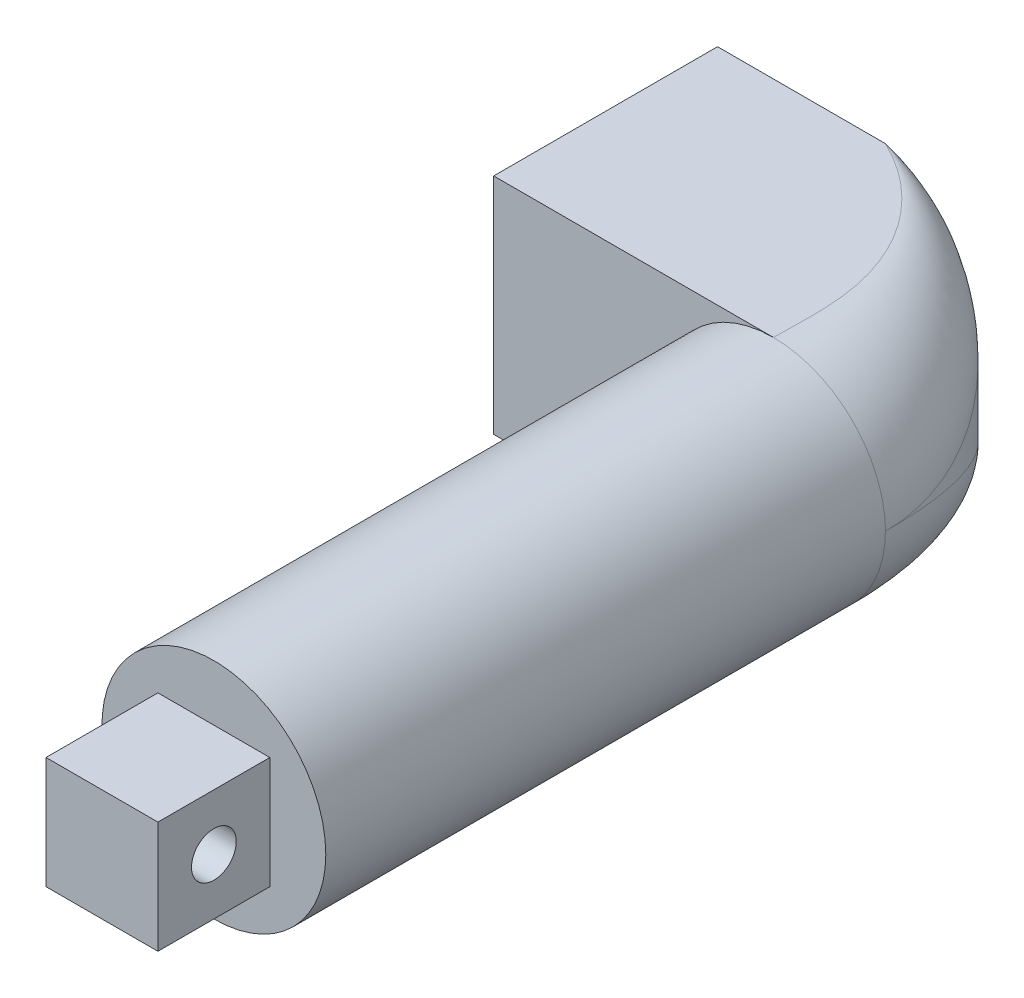
ISO-10303-21;
HEADER;
FILE_DESCRIPTION(('STEP AP214'),'2;1');
FILE_NAME('part.step','',(''),(''),'','','');
FILE_SCHEMA(('AUTOMOTIVE_DESIGN { 1 0 10303 214 1 1 1 1 }'));
ENDSEC;
DATA;
#1=APPLICATION_CONTEXT('core data for automotive mechanical design processes');
#2=APPLICATION_PROTOCOL_DEFINITION('international standard','automotive_design',2000,#1);
#3=PRODUCT_CONTEXT('',#1,'mechanical');
#4=PRODUCT('Part','Part','',(#3));
#5=PRODUCT_RELATED_PRODUCT_CATEGORY('part','',(#4));
#6=PRODUCT_DEFINITION_FORMATION('','',#4);
#7=PRODUCT_DEFINITION_CONTEXT('part definition',#1,'design');
#8=PRODUCT_DEFINITION('design','',#6,#7);
#9=PRODUCT_DEFINITION_SHAPE('','',#8);
#10=(LENGTH_UNIT() NAMED_UNIT(*) SI_UNIT(.MILLI.,.METRE.));
#11=(NAMED_UNIT(*) PLANE_ANGLE_UNIT() SI_UNIT($,.RADIAN.));
#12=(NAMED_UNIT(*) SI_UNIT($,.STERADIAN.) SOLID_ANGLE_UNIT());
#13=UNCERTAINTY_MEASURE_WITH_UNIT(LENGTH_MEASURE(1.E-05),#10,'distance_accuracy_value','');
#14=(GEOMETRIC_REPRESENTATION_CONTEXT(3) GLOBAL_UNCERTAINTY_ASSIGNED_CONTEXT((#13)) GLOBAL_UNIT_ASSIGNED_CONTEXT((#10,
#11,#12)) REPRESENTATION_CONTEXT('',''));
#15=CARTESIAN_POINT('',(0.,0.,0.));
#16=DIRECTION('',(0.,0.,1.));
#17=DIRECTION('',(1.,0.,0.));
#18=AXIS2_PLACEMENT_3D('',#15,#16,#17);
#19=CARTESIAN_POINT('',(15.,10.,10.));
#20=DIRECTION('',(0.,0.,-1.));
#21=DIRECTION('',(0.,1.,0.));
#22=AXIS2_PLACEMENT_3D('',#19,#20,#21);
#23=PLANE('',#22);
#24=CARTESIAN_POINT('',(24.9999999998989,0.,10.));
#25=DIRECTION('',(0.,0.,1.));
#26=DIRECTION('',(1.,0.,0.));
#27=AXIS2_PLACEMENT_3D('',#24,#25,#26);
#28=CIRCLE('',#27,10.0000000000875);
#29=CARTESIAN_POINT('',(24.9999790836981,10.0000000000656,10.));
#30=VERTEX_POINT('',#29);
#31=CARTESIAN_POINT('',(24.9999581674982,-10.,10.));
#32=VERTEX_POINT('',#31);
#33=EDGE_CURVE('E178',#30,#32,#28,.T.);
#34=ORIENTED_EDGE('',*,*,#33,.F.);
#35=DIRECTION('',(-1.,0.,0.));
#36=VECTOR('',#35,1.);
#37=CARTESIAN_POINT('',(15.,10.,10.));
#38=LINE('',#37,#36);
#39=CARTESIAN_POINT('',(0.,10.,10.));
#40=VERTEX_POINT('',#39);
#41=EDGE_CURVE('E239',#30,#40,#38,.T.);
#42=ORIENTED_EDGE('',*,*,#41,.T.);
#43=DIRECTION('',(0.,-1.,0.));
#44=VECTOR('',#43,1.);
#45=CARTESIAN_POINT('',(0.,10.,10.));
#46=LINE('',#45,#44);
#47=CARTESIAN_POINT('',(0.,-10.,10.));
#48=VERTEX_POINT('',#47);
#49=EDGE_CURVE('E230',#40,#48,#46,.T.);
#50=ORIENTED_EDGE('',*,*,#49,.T.);
#51=DIRECTION('',(-1.,0.,0.));
#52=VECTOR('',#51,1.);
#53=CARTESIAN_POINT('',(15.,-10.,10.));
#54=LINE('',#53,#52);
#55=EDGE_CURVE('E243',#32,#48,#54,.T.);
#56=ORIENTED_EDGE('',*,*,#55,.F.);
#57=EDGE_LOOP('',(#34,#42,#50,#56));
#58=FACE_BOUND('',#57,.T.);
#59=ADVANCED_FACE('F60',(#58),#23,.F.);
#60=CARTESIAN_POINT('',(15.,10.,10.));
#61=DIRECTION('',(0.,1.,0.));
#62=DIRECTION('',(0.,0.,1.));
#63=AXIS2_PLACEMENT_3D('',#60,#61,#62);
#64=PLANE('',#63);
#65=ORIENTED_EDGE('',*,*,#41,.F.);
#66=CARTESIAN_POINT('',(15.,10.,-10.));
#67=CARTESIAN_POINT('',(16.3749565177607,10.,-9.34350661944907));
#68=CARTESIAN_POINT('',(17.6118423525231,10.,-8.54557504270294));
#69=CARTESIAN_POINT('',(19.7751261513135,10.,-6.77535147640757));
#70=CARTESIAN_POINT('',(20.7011105689891,10.,-5.80380554577966));
#71=CARTESIAN_POINT('',(22.245432705062,10.,-3.7944516522111));
#72=CARTESIAN_POINT('',(22.8640307960509,10.,-2.75707721959613));
#73=CARTESIAN_POINT('',(23.8334490261289,10.,-0.7060221302084));
#74=CARTESIAN_POINT('',(24.1846624136271,10.,0.307343636058342));
#75=CARTESIAN_POINT('',(24.6852460589201,10.,2.24949239345835));
#76=CARTESIAN_POINT('',(24.8350972373865,10.,3.17811678628757));
#77=CARTESIAN_POINT('',(25.0116559788094,10.,4.92619712744708));
#78=CARTESIAN_POINT('',(25.038877066825,10.,5.74567292863553));
#79=CARTESIAN_POINT('',(25.0465000202597,10.,7.28932539063425));
#80=CARTESIAN_POINT('',(25.0273880128815,10.,8.01370464154866));
#81=CARTESIAN_POINT('',(25.0076434270292,10.,9.06553895436903));
#82=CARTESIAN_POINT('',(25.0023651337421,10.,9.41061528399421));
#83=CARTESIAN_POINT('',(24.9997626215836,10.,9.92643982329481));
#84=CARTESIAN_POINT('',(25.0009936060926,10.,10.0982045841938));
#85=CARTESIAN_POINT('',(24.9917178831913,10.,10.4416910596605));
#86=CARTESIAN_POINT('',(24.9826530695479,10.,10.6133147199374));
#87=CARTESIAN_POINT('',(24.9691733373313,10.,10.7845909572785));
#88=(BOUNDED_CURVE() B_SPLINE_CURVE(3,(#66,#67,#68,#69,#70,#71,#72,#73,#74,#75,#76,#77,#78,#79,
#80,#81,#82,#83,#84,#85,#86,#87),.UNSPECIFIED.,.F.,.F.) B_SPLINE_CURVE_WITH_KNOTS((4,2,2,2,2,2,
2,2,2,2,4),(0.,0.20616701789183,0.41233403578366,0.61850105367549,0.824668071567321,
1.03083508945915,1.23700210735098,1.44316912524281,1.54625263418873,1.59779438866168,
1.64933614313464),
.UNSPECIFIED.) CURVE() GEOMETRIC_REPRESENTATION_ITEM() RATIONAL_B_SPLINE_CURVE((1.,1.,1.,1.,1.,
1.,1.,1.,1.,1.,1.,1.,1.,1.,1.,1.,1.,1.,1.,1.,1.,1.)) REPRESENTATION_ITEM(''));
#89=CARTESIAN_POINT('',(15.,10.,-10.));
#90=VERTEX_POINT('',#89);
#91=EDGE_CURVE('E12',#30,#90,#88,.F.);
#92=ORIENTED_EDGE('',*,*,#91,.T.);
#93=DIRECTION('',(-1.,0.,0.));
#94=VECTOR('',#93,1.);
#95=CARTESIAN_POINT('',(15.,10.,-10.));
#96=LINE('',#95,#94);
#97=CARTESIAN_POINT('',(0.,10.,-10.));
#98=VERTEX_POINT('',#97);
#99=EDGE_CURVE('E257',#90,#98,#96,.T.);
#100=ORIENTED_EDGE('',*,*,#99,.T.);
#101=DIRECTION('',(0.,0.,-1.));
#102=VECTOR('',#101,1.);
#103=CARTESIAN_POINT('',(0.,10.,10.));
#104=LINE('',#103,#102);
#105=EDGE_CURVE('E221',#40,#98,#104,.T.);
#106=ORIENTED_EDGE('',*,*,#105,.F.);
#107=EDGE_LOOP('',(#65,#92,#100,#106));
#108=FACE_BOUND('',#107,.T.);
#109=ADVANCED_FACE('F293',(#108),#64,.T.);
#110=CARTESIAN_POINT('',(15.,-10.,10.));
#111=DIRECTION('',(0.,1.,0.));
#112=DIRECTION('',(0.,0.,1.));
#113=AXIS2_PLACEMENT_3D('',#110,#111,#112);
#114=PLANE('',#113);
#115=DIRECTION('',(-1.,0.,0.));
#116=VECTOR('',#115,1.);
#117=CARTESIAN_POINT('',(15.,-10.,-10.));
#118=LINE('',#117,#116);
#119=CARTESIAN_POINT('',(15.,-10.,-10.));
#120=VERTEX_POINT('',#119);
#121=CARTESIAN_POINT('',(0.,-10.,-10.));
#122=VERTEX_POINT('',#121);
#123=EDGE_CURVE('E388',#120,#122,#118,.T.);
#124=ORIENTED_EDGE('',*,*,#123,.F.);
#125=CARTESIAN_POINT('',(24.9691733373313,-10.,10.7845909572785));
#126=CARTESIAN_POINT('',(24.9826530695479,-10.,10.6133147199374));
#127=CARTESIAN_POINT('',(24.9917178831913,-10.,10.4416910596605));
#128=CARTESIAN_POINT('',(25.0009936060926,-10.,10.0982045841938));
#129=CARTESIAN_POINT('',(24.9997626215836,-10.,9.92643982329481));
#130=CARTESIAN_POINT('',(25.0023651337421,-10.,9.41061528399421));
#131=CARTESIAN_POINT('',(25.0076434270292,-10.,9.06553895436903));
#132=CARTESIAN_POINT('',(25.0273880128815,-10.,8.01370464154866));
#133=CARTESIAN_POINT('',(25.0465000202597,-10.,7.28932539063246));
#134=CARTESIAN_POINT('',(25.038877066825,-10.,5.74567292863732));
#135=CARTESIAN_POINT('',(25.0116559788118,-10.,4.92619712744649));
#136=CARTESIAN_POINT('',(24.8350972373841,-10.,3.17811678628817));
#137=CARTESIAN_POINT('',(24.6852460589201,-10.,2.24949239345835));
#138=CARTESIAN_POINT('',(24.1846624136271,-10.,0.307343636058344));
#139=CARTESIAN_POINT('',(23.8334490261313,-10.,-0.706022130210786));
#140=CARTESIAN_POINT('',(22.8640307960486,-10.,-2.75707721959375));
#141=CARTESIAN_POINT('',(22.2454327050596,-10.,-3.7944516522123));
#142=CARTESIAN_POINT('',(20.7011105689915,-10.,-5.80380554577847));
#143=CARTESIAN_POINT('',(19.7751261513135,-10.,-6.77535147640757));
#144=CARTESIAN_POINT('',(17.6118423525231,-10.,-8.54557504270294));
#145=CARTESIAN_POINT('',(16.374956517763,-10.,-9.34350661945392));
#146=CARTESIAN_POINT('',(15.,-10.,-10.));
#147=(BOUNDED_CURVE() B_SPLINE_CURVE(3,(#125,#126,#127,#128,#129,#130,#131,#132,#133,#134,#135,
#136,#137,#138,#139,#140,#141,#142,#143,#144,#145,#146),.UNSPECIFIED.,.F.,
.F.) B_SPLINE_CURVE_WITH_KNOTS((4,2,2,2,2,2,2,2,2,2,4),(0.,0.0515417544729575,0.103083508945915,
0.20616701789183,0.41233403578366,0.61850105367549,0.824668071567321,1.03083508945915,
1.23700210735098,1.44316912524281,1.64933614313464),
.UNSPECIFIED.) CURVE() GEOMETRIC_REPRESENTATION_ITEM() RATIONAL_B_SPLINE_CURVE((1.,1.,1.,1.,1.,
1.,1.,1.,1.,1.,1.,1.,1.,1.,1.,1.,1.,1.,1.,1.,1.,1.)) REPRESENTATION_ITEM(''));
#148=EDGE_CURVE('E242',#120,#32,#147,.F.);
#149=ORIENTED_EDGE('',*,*,#148,.T.);
#150=ORIENTED_EDGE('',*,*,#55,.T.);
#151=DIRECTION('',(0.,0.,-1.));
#152=VECTOR('',#151,1.);
#153=CARTESIAN_POINT('',(0.,-10.,10.));
#154=LINE('',#153,#152);
#155=EDGE_CURVE('E227',#48,#122,#154,.T.);
#156=ORIENTED_EDGE('',*,*,#155,.T.);
#157=EDGE_LOOP('',(#124,#149,#150,#156));
#158=FACE_BOUND('',#157,.T.);
#159=ADVANCED_FACE('F302',(#158),#114,.F.);
#160=CARTESIAN_POINT('',(15.,10.,-10.));
#161=DIRECTION('',(0.,0.,-1.));
#162=DIRECTION('',(0.,1.,0.));
#163=AXIS2_PLACEMENT_3D('',#160,#161,#162);
#164=PLANE('',#163);
#165=DIRECTION('',(0.,-1.,0.));
#166=VECTOR('',#165,1.);
#167=CARTESIAN_POINT('',(0.,10.,-10.));
#168=LINE('',#167,#166);
#169=EDGE_CURVE('E224',#98,#122,#168,.T.);
#170=ORIENTED_EDGE('',*,*,#169,.F.);
#171=ORIENTED_EDGE('',*,*,#99,.F.);
#172=DIRECTION('',(0.,-1.,0.));
#173=VECTOR('',#172,1.);
#174=CARTESIAN_POINT('',(15.,10.,-10.));
#175=LINE('',#174,#173);
#176=EDGE_CURVE('E233',#90,#120,#175,.T.);
#177=ORIENTED_EDGE('',*,*,#176,.T.);
#178=ORIENTED_EDGE('',*,*,#123,.T.);
#179=EDGE_LOOP('',(#170,#171,#177,#178));
#180=FACE_BOUND('',#179,.T.);
#181=ADVANCED_FACE('F303',(#180),#164,.T.);
#182=CARTESIAN_POINT('',(0.,0.,0.));
#183=DIRECTION('',(-1.,0.,0.));
#184=DIRECTION('',(0.,0.,1.));
#185=AXIS2_PLACEMENT_3D('',#182,#183,#184);
#186=PLANE('',#185);
#187=DIRECTION('',(0.,-1.,0.));
#188=VECTOR('',#187,1.);
#189=CARTESIAN_POINT('',(0.,0.,-7.75));
#190=LINE('',#189,#188);
#191=CARTESIAN_POINT('',(0.,7.75,-7.75));
#192=VERTEX_POINT('',#191);
#193=CARTESIAN_POINT('',(0.,-7.75,-7.75));
#194=VERTEX_POINT('',#193);
#195=EDGE_CURVE('E189',#192,#194,#190,.T.);
#196=ORIENTED_EDGE('',*,*,#195,.F.);
#197=DIRECTION('',(0.,0.,-1.));
#198=VECTOR('',#197,1.);
#199=CARTESIAN_POINT('',(0.,7.75,0.));
#200=LINE('',#199,#198);
#201=CARTESIAN_POINT('',(0.,7.75,7.75));
#202=VERTEX_POINT('',#201);
#203=EDGE_CURVE('E205',#202,#192,#200,.T.);
#204=ORIENTED_EDGE('',*,*,#203,.F.);
#205=DIRECTION('',(0.,-1.,0.));
#206=VECTOR('',#205,1.);
#207=CARTESIAN_POINT('',(0.,0.,7.75));
#208=LINE('',#207,#206);
#209=CARTESIAN_POINT('',(0.,-7.75,7.75));
#210=VERTEX_POINT('',#209);
#211=EDGE_CURVE('E208',#202,#210,#208,.T.);
#212=ORIENTED_EDGE('',*,*,#211,.T.);
#213=DIRECTION('',(0.,0.,-1.));
#214=VECTOR('',#213,1.);
#215=CARTESIAN_POINT('',(0.,-7.75,0.));
#216=LINE('',#215,#214);
#217=EDGE_CURVE('E195',#210,#194,#216,.T.);
#218=ORIENTED_EDGE('',*,*,#217,.T.);
#219=EDGE_LOOP('',(#196,#204,#212,#218));
#220=FACE_BOUND('',#219,.T.);
#221=ORIENTED_EDGE('',*,*,#105,.T.);
#222=ORIENTED_EDGE('',*,*,#169,.T.);
#223=ORIENTED_EDGE('',*,*,#155,.F.);
#224=ORIENTED_EDGE('',*,*,#49,.F.);
#225=EDGE_LOOP('',(#221,#222,#223,#224));
#226=FACE_BOUND('',#225,.T.);
#227=ADVANCED_FACE('F404',(#220,#226),#186,.T.);
#228=CARTESIAN_POINT('',(15.,0.,-7.75));
#229=DIRECTION('',(0.,0.,-1.));
#230=DIRECTION('',(0.,1.,0.));
#231=AXIS2_PLACEMENT_3D('',#228,#229,#230);
#232=PLANE('',#231);
#233=ORIENTED_EDGE('',*,*,#195,.T.);
#234=DIRECTION('',(-1.,0.,0.));
#235=VECTOR('',#234,1.);
#236=CARTESIAN_POINT('',(15.,-7.75,-7.75));
#237=LINE('',#236,#235);
#238=CARTESIAN_POINT('',(15.,-7.75,-7.75));
#239=VERTEX_POINT('',#238);
#240=EDGE_CURVE('E203',#239,#194,#237,.T.);
#241=ORIENTED_EDGE('',*,*,#240,.F.);
#242=DIRECTION('',(0.,-1.,0.));
#243=VECTOR('',#242,1.);
#244=CARTESIAN_POINT('',(15.,0.,-7.75));
#245=LINE('',#244,#243);
#246=CARTESIAN_POINT('',(15.,7.75,-7.75));
#247=VERTEX_POINT('',#246);
#248=EDGE_CURVE('E192',#247,#239,#245,.T.);
#249=ORIENTED_EDGE('',*,*,#248,.F.);
#250=DIRECTION('',(-1.,0.,0.));
#251=VECTOR('',#250,1.);
#252=CARTESIAN_POINT('',(15.,7.75,-7.75));
#253=LINE('',#252,#251);
#254=EDGE_CURVE('E219',#247,#192,#253,.T.);
#255=ORIENTED_EDGE('',*,*,#254,.T.);
#256=EDGE_LOOP('',(#233,#241,#249,#255));
#257=FACE_BOUND('',#256,.T.);
#258=ADVANCED_FACE('F406',(#257),#232,.F.);
#259=CARTESIAN_POINT('',(15.,7.75,0.));
#260=DIRECTION('',(0.,1.,0.));
#261=DIRECTION('',(0.,0.,1.));
#262=AXIS2_PLACEMENT_3D('',#259,#260,#261);
#263=PLANE('',#262);
#264=ORIENTED_EDGE('',*,*,#203,.T.);
#265=ORIENTED_EDGE('',*,*,#254,.F.);
#266=DIRECTION('',(0.,0.,-1.));
#267=VECTOR('',#266,1.);
#268=CARTESIAN_POINT('',(15.,7.75,0.));
#269=LINE('',#268,#267);
#270=CARTESIAN_POINT('',(15.,7.75,7.75));
#271=VERTEX_POINT('',#270);
#272=EDGE_CURVE('E194',#271,#247,#269,.T.);
#273=ORIENTED_EDGE('',*,*,#272,.F.);
#274=DIRECTION('',(-1.,0.,0.));
#275=VECTOR('',#274,1.);
#276=CARTESIAN_POINT('',(15.,7.75,7.75));
#277=LINE('',#276,#275);
#278=EDGE_CURVE('E217',#271,#202,#277,.T.);
#279=ORIENTED_EDGE('',*,*,#278,.T.);
#280=EDGE_LOOP('',(#264,#265,#273,#279));
#281=FACE_BOUND('',#280,.T.);
#282=ADVANCED_FACE('F413',(#281),#263,.F.);
#283=CARTESIAN_POINT('',(15.,0.,7.75));
#284=DIRECTION('',(0.,0.,-1.));
#285=DIRECTION('',(0.,1.,0.));
#286=AXIS2_PLACEMENT_3D('',#283,#284,#285);
#287=PLANE('',#286);
#288=ORIENTED_EDGE('',*,*,#211,.F.);
#289=ORIENTED_EDGE('',*,*,#278,.F.);
#290=DIRECTION('',(0.,-1.,0.));
#291=VECTOR('',#290,1.);
#292=CARTESIAN_POINT('',(15.,0.,7.75));
#293=LINE('',#292,#291);
#294=CARTESIAN_POINT('',(15.,-7.75,7.75));
#295=VERTEX_POINT('',#294);
#296=EDGE_CURVE('E197',#271,#295,#293,.T.);
#297=ORIENTED_EDGE('',*,*,#296,.T.);
#298=DIRECTION('',(-1.,0.,0.));
#299=VECTOR('',#298,1.);
#300=CARTESIAN_POINT('',(15.,-7.75,7.75));
#301=LINE('',#300,#299);
#302=EDGE_CURVE('E215',#295,#210,#301,.T.);
#303=ORIENTED_EDGE('',*,*,#302,.T.);
#304=EDGE_LOOP('',(#288,#289,#297,#303));
#305=FACE_BOUND('',#304,.T.);
#306=ADVANCED_FACE('F586',(#305),#287,.T.);
#307=CARTESIAN_POINT('',(15.,-7.75,0.));
#308=DIRECTION('',(0.,1.,0.));
#309=DIRECTION('',(0.,0.,1.));
#310=AXIS2_PLACEMENT_3D('',#307,#308,#309);
#311=PLANE('',#310);
#312=ORIENTED_EDGE('',*,*,#217,.F.);
#313=ORIENTED_EDGE('',*,*,#302,.F.);
#314=DIRECTION('',(0.,0.,-1.));
#315=VECTOR('',#314,1.);
#316=CARTESIAN_POINT('',(15.,-7.75,0.));
#317=LINE('',#316,#315);
#318=EDGE_CURVE('E200',#295,#239,#317,.T.);
#319=ORIENTED_EDGE('',*,*,#318,.T.);
#320=ORIENTED_EDGE('',*,*,#240,.T.);
#321=EDGE_LOOP('',(#312,#313,#319,#320));
#322=FACE_BOUND('',#321,.T.);
#323=ADVANCED_FACE('F457',(#322),#311,.T.);
#324=CARTESIAN_POINT('',(15.,0.,0.));
#325=DIRECTION('',(-1.,0.,0.));
#326=DIRECTION('',(0.,0.,1.));
#327=AXIS2_PLACEMENT_3D('',#324,#325,#326);
#328=PLANE('',#327);
#329=ORIENTED_EDGE('',*,*,#296,.F.);
#330=ORIENTED_EDGE('',*,*,#272,.T.);
#331=ORIENTED_EDGE('',*,*,#248,.T.);
#332=ORIENTED_EDGE('',*,*,#318,.F.);
#333=EDGE_LOOP('',(#329,#330,#331,#332));
#334=FACE_BOUND('',#333,.T.);
#335=ADVANCED_FACE('F269',(#334),#328,.T.);
#336=CARTESIAN_POINT('',(15.,0.,10.));
#337=DIRECTION('',(0.,-1.,0.));
#338=DIRECTION('',(0.,0.,-1.));
#339=AXIS2_PLACEMENT_3D('',#336,#337,#338);
#340=CYLINDRICAL_SURFACE('',#339,20.);
#341=CARTESIAN_POINT('',(34.9383466746626,0.,11.5691819145569));
#342=CARTESIAN_POINT('',(34.965306139097,0.,11.2266294398749));
#343=CARTESIAN_POINT('',(34.9834357663823,0.,10.883382119321));
#344=CARTESIAN_POINT('',(35.0019872121856,0.,10.1964091683877));
#345=CARTESIAN_POINT('',(35.0024090270872,-0.00144386285960368,9.8526836364662));
#346=CARTESIAN_POINT('',(34.9771110675979,0.0138168333852222,8.82215901569282));
#347=CARTESIAN_POINT('',(34.9248044387159,0.0451873780405984,8.13601392966993));
#348=CARTESIAN_POINT('',(34.6623929898257,0.198649902121924,6.09111193822538));
#349=CARTESIAN_POINT('',(34.3464311764276,0.380092773660664,4.74598204213419));
#350=CARTESIAN_POINT('',(33.4458106822476,0.878637695089336,2.14881077539806));
#351=CARTESIAN_POINT('',(32.8611790641125,1.19573974631466,0.896847446871601));
#352=CARTESIAN_POINT('',(31.4479653358984,1.9429931638416,-1.46095721460047));
#353=CARTESIAN_POINT('',(30.6194256913203,2.37314453147233,-2.56672769813793));
#354=CARTESIAN_POINT('',(28.7534746861072,3.32388671852766,-4.58530212317974));
#355=CARTESIAN_POINT('',(27.7161193952266,3.84447753928414,-5.49804540876557));
#356=CARTESIAN_POINT('',(25.4764625298339,4.95348876930961,-7.09189389233401));
#357=CARTESIAN_POINT('',(24.2742282545247,5.54190917990907,-7.77295119694005));
#358=CARTESIAN_POINT('',(21.755725069601,6.76396972634093,-8.87456708774539));
#359=CARTESIAN_POINT('',(20.4395318382309,7.39760986350338,-9.29509257160221));
#360=CARTESIAN_POINT('',(17.7488522701442,8.68749999977787,-9.85781748236069));
#361=CARTESIAN_POINT('',(16.3744622152341,9.34374263315969,-10.));
#362=CARTESIAN_POINT('',(15.,10.,-10.));
#363=(BOUNDED_CURVE() B_SPLINE_CURVE(3,(#341,#342,#343,#344,#345,#346,#347,#348,#349,#350,#351,
#352,#353,#354,#355,#356,#357,#358,#359,#360,#361,#362),.UNSPECIFIED.,.F.,
.F.) B_SPLINE_CURVE_WITH_KNOTS((4,2,2,2,2,2,2,2,2,2,4),(0.,0.0515417544729575,0.103083508945915,
0.20616701789183,0.41233403578366,0.61850105367549,0.824668071567321,1.03083508945915,
1.23700210735098,1.44316912524281,1.64933614313464),
.UNSPECIFIED.) CURVE() GEOMETRIC_REPRESENTATION_ITEM() RATIONAL_B_SPLINE_CURVE((1.,1.,1.,1.,1.,
1.,1.,1.,1.,1.,1.,1.,1.,1.,1.,1.,1.,1.,1.,1.,1.,1.)) REPRESENTATION_ITEM(''));
#364=CARTESIAN_POINT('',(34.9999999999639,2.11824543335629E-05,10.));
#365=VERTEX_POINT('',#364);
#366=EDGE_CURVE('E251',#90,#365,#363,.F.);
#367=ORIENTED_EDGE('',*,*,#366,.T.);
#368=CARTESIAN_POINT('',(15.,-10.,-10.));
#369=CARTESIAN_POINT('',(16.3744622152328,-9.34374263316029,-10.));
#370=CARTESIAN_POINT('',(17.7488522701463,-8.68749999977787,-9.85781748236026));
#371=CARTESIAN_POINT('',(20.4395318382289,-7.39760986350338,-9.29509257160264));
#372=CARTESIAN_POINT('',(21.7557250696083,-6.76396972634093,-8.87456708774219));
#373=CARTESIAN_POINT('',(24.2742282545174,-5.54190917990907,-7.77295119694325));
#374=CARTESIAN_POINT('',(25.4764625298345,-4.95348876930961,-7.09189389233361));
#375=CARTESIAN_POINT('',(27.7161193952261,-3.84447753928414,-5.49804540876598));
#376=CARTESIAN_POINT('',(28.7534746861072,-3.32388671852766,-4.58530212317974));
#377=CARTESIAN_POINT('',(30.6194256913203,-2.37314453147233,-2.56672769813793));
#378=CARTESIAN_POINT('',(31.4479653358979,-1.9429931638416,-1.46095721460125));
#379=CARTESIAN_POINT('',(32.861179064113,-1.19573974631466,0.896847446872393));
#380=CARTESIAN_POINT('',(33.4458106822478,-0.878637695089336,2.14881077539885));
#381=CARTESIAN_POINT('',(34.3464311764273,-0.380092773660664,4.74598204213339));
#382=CARTESIAN_POINT('',(34.6623929898257,-0.198649902121924,6.09111193822538));
#383=CARTESIAN_POINT('',(34.9248044387159,-0.0451873780405984,8.13601392966993));
#384=CARTESIAN_POINT('',(34.9771110675979,-0.0138168333852222,8.82215901569281));
#385=CARTESIAN_POINT('',(35.0024090270872,0.00144386285960368,9.8526836364662));
#386=CARTESIAN_POINT('',(35.0019872121856,0.,10.1964091683877));
#387=CARTESIAN_POINT('',(34.9834357663823,0.,10.883382119321));
#388=CARTESIAN_POINT('',(34.965306139097,0.,11.2266294398749));
#389=CARTESIAN_POINT('',(34.9383466746626,0.,11.5691819145569));
#390=(BOUNDED_CURVE() B_SPLINE_CURVE(3,(#368,#369,#370,#371,#372,#373,#374,#375,#376,#377,#378,
#379,#380,#381,#382,#383,#384,#385,#386,#387,#388,#389),.UNSPECIFIED.,.F.,
.F.) B_SPLINE_CURVE_WITH_KNOTS((4,2,2,2,2,2,2,2,2,2,4),(0.,0.20616701789183,0.41233403578366,
0.61850105367549,0.824668071567321,1.03083508945915,1.23700210735098,1.44316912524281,
1.54625263418873,1.59779438866168,1.64933614313464),
.UNSPECIFIED.) CURVE() GEOMETRIC_REPRESENTATION_ITEM() RATIONAL_B_SPLINE_CURVE((1.,1.,1.,1.,1.,
1.,1.,1.,1.,1.,1.,1.,1.,1.,1.,1.,1.,1.,1.,1.,1.,1.)) REPRESENTATION_ITEM(''));
#391=EDGE_CURVE('E75',#365,#120,#390,.F.);
#392=ORIENTED_EDGE('',*,*,#391,.T.);
#393=ORIENTED_EDGE('',*,*,#176,.F.);
#394=EDGE_LOOP('',(#367,#392,#393));
#395=FACE_BOUND('',#394,.T.);
#396=ADVANCED_FACE('F259',(#395),#340,.T.);
#397=CARTESIAN_POINT('',(15.,-10.,-10.));
#398=CARTESIAN_POINT('',(16.374956517763,-10.,-9.34350661945392));
#399=CARTESIAN_POINT('',(17.6118423525231,-10.,-8.54557504270294));
#400=CARTESIAN_POINT('',(19.7751261513135,-10.,-6.77535147640757));
#401=CARTESIAN_POINT('',(20.7011105689915,-10.,-5.80380554577847));
#402=CARTESIAN_POINT('',(22.2454327050596,-10.,-3.7944516522123));
#403=CARTESIAN_POINT('',(22.8640307960486,-10.,-2.75707721959375));
#404=CARTESIAN_POINT('',(23.8334490261313,-10.,-0.706022130210786));
#405=CARTESIAN_POINT('',(24.1846624136271,-10.,0.307343636058344));
#406=CARTESIAN_POINT('',(24.6852460589201,-10.,2.24949239345835));
#407=CARTESIAN_POINT('',(24.8350972373841,-10.,3.17811678628817));
#408=CARTESIAN_POINT('',(25.0116559788118,-10.,4.92619712744649));
#409=CARTESIAN_POINT('',(25.038877066825,-10.,5.74567292863732));
#410=CARTESIAN_POINT('',(25.0465000202597,-10.,7.28932539063246));
#411=CARTESIAN_POINT('',(25.0273880128815,-10.,8.01370464154866));
#412=CARTESIAN_POINT('',(25.0076434270292,-10.,9.06553895436903));
#413=CARTESIAN_POINT('',(25.0023651337421,-10.,9.41061528399421));
#414=CARTESIAN_POINT('',(24.9997626215836,-10.,9.92643982329481));
#415=CARTESIAN_POINT('',(25.0009936060926,-10.,10.0982045841938));
#416=CARTESIAN_POINT('',(24.9917178831913,-10.,10.4416910596605));
#417=CARTESIAN_POINT('',(24.9826530695479,-10.,10.6133147199374));
#418=CARTESIAN_POINT('',(24.9691733373313,-10.,10.7845909572785));
#419=CARTESIAN_POINT('',(15.,-10.,-10.));
#420=CARTESIAN_POINT('',(16.3744657327191,-9.99999999999523,-10.0000000000048));
#421=CARTESIAN_POINT('',(17.7488522701466,-10.,-9.85781748236174));
#422=CARTESIAN_POINT('',(20.4395318382286,-10.,-9.29509257160116));
#423=CARTESIAN_POINT('',(21.7557250696082,-9.99999999999881,-8.87456708774189));
#424=CARTESIAN_POINT('',(24.2742282545175,-10.0000000000012,-7.77295119694356));
#425=CARTESIAN_POINT('',(25.4764625298333,-10.0000000000012,-7.09189389233189));
#426=CARTESIAN_POINT('',(27.7161193952273,-9.99999999999881,-5.4980454087677));
#427=CARTESIAN_POINT('',(28.7534746861072,-10.0000000000012,-4.58530212318212));
#428=CARTESIAN_POINT('',(30.6194256913203,-9.99999999999881,-2.56672769813555));
#429=CARTESIAN_POINT('',(31.4479653358978,-9.99999999999762,-1.46095721460055));
#430=CARTESIAN_POINT('',(32.8611790641131,-10.0000000000024,0.896847446871693));
#431=CARTESIAN_POINT('',(33.4458106822506,-9.99999999999762,2.14881077539939));
#432=CARTESIAN_POINT('',(34.3464311764245,-10.0000000000024,4.74598204213285));
#433=CARTESIAN_POINT('',(34.6623929898225,-10.,6.09111193822579));
#434=CARTESIAN_POINT('',(34.9248044387175,-10.,8.13601392966973));
#435=CARTESIAN_POINT('',(34.977111067599,-10.0000000000012,8.82215901569278));
#436=CARTESIAN_POINT('',(35.0024090270867,-9.9999999999994,9.85268363646621));
#437=CARTESIAN_POINT('',(35.0019872121852,-10.,10.1964091683876));
#438=CARTESIAN_POINT('',(34.9834357663827,-10.,10.883382119321));
#439=CARTESIAN_POINT('',(34.9653061391007,-9.99999999999762,11.2266294398752));
#440=CARTESIAN_POINT('',(34.9383466746626,-10.,11.5691819145569));
#441=CARTESIAN_POINT('',(15.,-10.,-10.));
#442=CARTESIAN_POINT('',(16.3744622152328,-9.34374263316029,-10.));
#443=CARTESIAN_POINT('',(17.7488522701463,-8.68749999977787,-9.85781748236026));
#444=CARTESIAN_POINT('',(20.4395318382289,-7.39760986350338,-9.29509257160264));
#445=CARTESIAN_POINT('',(21.7557250696083,-6.76396972634093,-8.87456708774219));
#446=CARTESIAN_POINT('',(24.2742282545174,-5.54190917990907,-7.77295119694325));
#447=CARTESIAN_POINT('',(25.4764625298345,-4.95348876930961,-7.09189389233361));
#448=CARTESIAN_POINT('',(27.7161193952261,-3.84447753928414,-5.49804540876598));
#449=CARTESIAN_POINT('',(28.7534746861072,-3.32388671852766,-4.58530212317974));
#450=CARTESIAN_POINT('',(30.6194256913203,-2.37314453147233,-2.56672769813793));
#451=CARTESIAN_POINT('',(31.4479653358979,-1.9429931638416,-1.46095721460125));
#452=CARTESIAN_POINT('',(32.861179064113,-1.19573974631466,0.896847446872393));
#453=CARTESIAN_POINT('',(33.4458106822478,-0.878637695089336,2.14881077539885));
#454=CARTESIAN_POINT('',(34.3464311764273,-0.380092773660664,4.74598204213339));
#455=CARTESIAN_POINT('',(34.6623929898257,-0.198649902121924,6.09111193822538));
#456=CARTESIAN_POINT('',(34.9248044387159,-0.0451873780405984,8.13601392966993));
#457=CARTESIAN_POINT('',(34.9771110675979,-0.0138168333852222,8.82215901569281));
#458=CARTESIAN_POINT('',(35.0024090270872,0.00144386285960368,9.8526836364662));
#459=CARTESIAN_POINT('',(35.0019872121856,0.,10.1964091683877));
#460=CARTESIAN_POINT('',(34.9834357663823,0.,10.883382119321));
#461=CARTESIAN_POINT('',(34.965306139097,0.,11.2266294398749));
#462=CARTESIAN_POINT('',(34.9383466746626,0.,11.5691819145569));
#463=(BOUNDED_SURFACE() B_SPLINE_SURFACE(2,3,((#397,#398,#399,#400,#401,#402,#403,#404,#405,
#406,#407,#408,#409,#410,#411,#412,#413,#414,#415,#416,#417,#418),(#419,#420,#421,#422,#423,
#424,#425,#426,#427,#428,#429,#430,#431,#432,#433,#434,#435,#436,#437,#438,#439,#440),(#441,
#442,#443,#444,#445,#446,#447,#448,#449,#450,#451,#452,#453,#454,#455,#456,#457,#458,#459,#460,
#461,#462)),.UNSPECIFIED.,.F.,.F.,.F.) B_SPLINE_SURFACE_WITH_KNOTS((3,3),(4,2,2,2,2,2,2,2,2,2,
4),(0.,1.),(0.,0.20616701789183,0.41233403578366,0.61850105367549,0.824668071567321,
1.03083508945915,1.23700210735098,1.44316912524281,1.54625263418873,1.59779438866168,
1.64933614313464),.UNSPECIFIED.) GEOMETRIC_REPRESENTATION_ITEM() RATIONAL_B_SPLINE_SURFACE(((1.,
1.,1.,1.,1.,1.,1.,1.,1.,1.,1.,1.,1.,1.,1.,1.,1.,1.,1.,1.,1.,1.),(0.707106781186548,
0.707106781186548,0.707106781186548,0.707106781186548,0.707106781186548,0.707106781186548,
0.707106781186548,0.707106781186548,0.707106781186548,0.707106781186548,0.707106781186548,
0.707106781186548,0.707106781186548,0.707106781186548,0.707106781186548,0.707106781186548,
0.707106781186548,0.707106781186548,0.707106781186548,0.707106781186548,0.707106781186548,
0.707106781186548),(1.,1.,1.,1.,1.,1.,1.,1.,1.,1.,1.,1.,1.,1.,1.,1.,1.,1.,1.,1.,1.,1.))) REPRESENTATION_ITEM('') SURFACE());
#464=CARTESIAN_POINT('',(34.9999996340996,4.23146510295195E-05,9.99997443500805));
#465=CARTESIAN_POINT('',(34.9999996340993,-9.99999999999977,9.99997443500805));
#466=CARTESIAN_POINT('',(24.9999581172428,-10.,10.0000127826847));
#467=(BOUNDED_CURVE() B_SPLINE_CURVE(2,(#464,#465,#466),.UNSPECIFIED.,.F.,
.F.) B_SPLINE_CURVE_WITH_KNOTS((3,3),(0.,1.),
.UNSPECIFIED.) CURVE() GEOMETRIC_REPRESENTATION_ITEM() RATIONAL_B_SPLINE_CURVE((1.,
0.707106781186547,1.)) REPRESENTATION_ITEM(''));
#468=EDGE_CURVE('E381',#32,#365,#467,.F.);
#469=ORIENTED_EDGE('',*,*,#148,.F.);
#470=ORIENTED_EDGE('',*,*,#391,.F.);
#471=ORIENTED_EDGE('',*,*,#468,.F.);
#472=EDGE_LOOP('',(#469,#470,#471));
#473=FACE_BOUND('',#472,.T.);
#474=ADVANCED_FACE('F268',(#473),#463,.T.);
#475=CARTESIAN_POINT('',(15.,10.,-10.));
#476=CARTESIAN_POINT('',(16.3744622152341,9.34374263315969,-10.));
#477=CARTESIAN_POINT('',(17.7488522701442,8.68749999977787,-9.85781748236069));
#478=CARTESIAN_POINT('',(20.4395318382309,7.39760986350338,-9.29509257160221));
#479=CARTESIAN_POINT('',(21.755725069601,6.76396972634093,-8.87456708774539));
#480=CARTESIAN_POINT('',(24.2742282545247,5.54190917990907,-7.77295119694005));
#481=CARTESIAN_POINT('',(25.4764625298339,4.95348876930961,-7.09189389233401));
#482=CARTESIAN_POINT('',(27.7161193952266,3.84447753928414,-5.49804540876557));
#483=CARTESIAN_POINT('',(28.7534746861072,3.32388671852766,-4.58530212317974));
#484=CARTESIAN_POINT('',(30.6194256913203,2.37314453147233,-2.56672769813793));
#485=CARTESIAN_POINT('',(31.4479653358984,1.9429931638416,-1.46095721460047));
#486=CARTESIAN_POINT('',(32.8611790641125,1.19573974631466,0.896847446871601));
#487=CARTESIAN_POINT('',(33.4458106822476,0.878637695089336,2.14881077539806));
#488=CARTESIAN_POINT('',(34.3464311764276,0.380092773660664,4.74598204213419));
#489=CARTESIAN_POINT('',(34.6623929898257,0.198649902121924,6.09111193822538));
#490=CARTESIAN_POINT('',(34.9248044387159,0.0451873780405984,8.13601392966993));
#491=CARTESIAN_POINT('',(34.9771110675979,0.0138168333852222,8.82215901569282));
#492=CARTESIAN_POINT('',(35.0024090270872,-0.00144386285960368,9.8526836364662));
#493=CARTESIAN_POINT('',(35.0019872121856,0.,10.1964091683877));
#494=CARTESIAN_POINT('',(34.9834357663823,0.,10.883382119321));
#495=CARTESIAN_POINT('',(34.965306139097,0.,11.2266294398749));
#496=CARTESIAN_POINT('',(34.9383466746626,0.,11.5691819145569));
#497=CARTESIAN_POINT('',(15.,10.,-10.));
#498=CARTESIAN_POINT('',(16.3744657327209,9.99999999999881,-10.0000000000024));
#499=CARTESIAN_POINT('',(17.7488522701442,9.99999999999762,-9.85781748236055));
#500=CARTESIAN_POINT('',(20.439531838231,10.0000000000024,-9.29509257160236));
#501=CARTESIAN_POINT('',(21.755725069601,9.99999999999881,-8.87456708774546));
#502=CARTESIAN_POINT('',(24.2742282545246,10.0000000000012,-7.77295119693998));
#503=CARTESIAN_POINT('',(25.4764625298333,9.99999999999761,-7.09189389233367));
#504=CARTESIAN_POINT('',(27.7161193952273,10.0000000000024,-5.49804540876591));
#505=CARTESIAN_POINT('',(28.7534746861072,10.0000000000012,-4.58530212318212));
#506=CARTESIAN_POINT('',(30.6194256913203,9.99999999999881,-2.56672769813555));
#507=CARTESIAN_POINT('',(31.4479653359073,9.99999999999523,-1.46095721459996));
#508=CARTESIAN_POINT('',(32.8611790641036,10.0000000000048,0.896847446871092));
#509=CARTESIAN_POINT('',(33.4458106822506,9.99999999999762,2.14881077539791));
#510=CARTESIAN_POINT('',(34.3464311764245,10.0000000000024,4.74598204213435));
#511=CARTESIAN_POINT('',(34.6623929898225,10.,6.09111193822579));
#512=CARTESIAN_POINT('',(34.9248044387175,10.,8.13601392966973));
#513=CARTESIAN_POINT('',(34.977111067599,10.0000000000012,8.82215901569279));
#514=CARTESIAN_POINT('',(35.0024090270866,9.99999999999941,9.85268363646622));
#515=CARTESIAN_POINT('',(35.0019872121852,10.,10.1964091683876));
#516=CARTESIAN_POINT('',(34.9834357663827,10.,10.883382119321));
#517=CARTESIAN_POINT('',(34.9653061391007,9.99999999999762,11.2266294398752));
#518=CARTESIAN_POINT('',(34.9383466746626,10.,11.5691819145569));
#519=CARTESIAN_POINT('',(15.,10.,-10.));
#520=CARTESIAN_POINT('',(16.3749565177607,10.,-9.34350661944907));
#521=CARTESIAN_POINT('',(17.6118423525231,10.,-8.54557504270294));
#522=CARTESIAN_POINT('',(19.7751261513135,10.,-6.77535147640757));
#523=CARTESIAN_POINT('',(20.7011105689891,10.,-5.80380554577966));
#524=CARTESIAN_POINT('',(22.245432705062,10.,-3.7944516522111));
#525=CARTESIAN_POINT('',(22.8640307960509,10.,-2.75707721959613));
#526=CARTESIAN_POINT('',(23.8334490261289,10.,-0.7060221302084));
#527=CARTESIAN_POINT('',(24.1846624136271,10.,0.307343636058342));
#528=CARTESIAN_POINT('',(24.6852460589201,10.,2.24949239345835));
#529=CARTESIAN_POINT('',(24.8350972373865,10.,3.17811678628757));
#530=CARTESIAN_POINT('',(25.0116559788094,10.,4.92619712744708));
#531=CARTESIAN_POINT('',(25.038877066825,10.,5.74567292863553));
#532=CARTESIAN_POINT('',(25.0465000202597,10.,7.28932539063425));
#533=CARTESIAN_POINT('',(25.0273880128815,10.,8.01370464154866));
#534=CARTESIAN_POINT('',(25.0076434270292,10.,9.06553895436903));
#535=CARTESIAN_POINT('',(25.0023651337421,10.,9.41061528399421));
#536=CARTESIAN_POINT('',(24.9997626215836,10.,9.92643982329481));
#537=CARTESIAN_POINT('',(25.0009936060926,10.,10.0982045841938));
#538=CARTESIAN_POINT('',(24.9917178831913,10.,10.4416910596605));
#539=CARTESIAN_POINT('',(24.9826530695479,10.,10.6133147199374));
#540=CARTESIAN_POINT('',(24.9691733373313,10.,10.7845909572785));
#541=(BOUNDED_SURFACE() B_SPLINE_SURFACE(2,3,((#475,#476,#477,#478,#479,#480,#481,#482,#483,
#484,#485,#486,#487,#488,#489,#490,#491,#492,#493,#494,#495,#496),(#497,#498,#499,#500,#501,
#502,#503,#504,#505,#506,#507,#508,#509,#510,#511,#512,#513,#514,#515,#516,#517,#518),(#519,
#520,#521,#522,#523,#524,#525,#526,#527,#528,#529,#530,#531,#532,#533,#534,#535,#536,#537,#538,
#539,#540)),.UNSPECIFIED.,.F.,.F.,.F.) B_SPLINE_SURFACE_WITH_KNOTS((3,3),(4,2,2,2,2,2,2,2,2,2,
4),(0.,1.),(0.,0.20616701789183,0.41233403578366,0.61850105367549,0.824668071567321,
1.03083508945915,1.23700210735098,1.44316912524281,1.54625263418873,1.59779438866168,
1.64933614313464),.UNSPECIFIED.) GEOMETRIC_REPRESENTATION_ITEM() RATIONAL_B_SPLINE_SURFACE(((1.,
1.,1.,1.,1.,1.,1.,1.,1.,1.,1.,1.,1.,1.,1.,1.,1.,1.,1.,1.,1.,1.),(0.707106781186548,
0.707106781186548,0.707106781186547,0.707106781186547,0.707106781186548,0.707106781186548,
0.707106781186548,0.707106781186548,0.707106781186548,0.707106781186548,0.707106781186548,
0.707106781186548,0.707106781186548,0.707106781186548,0.707106781186548,0.707106781186548,
0.707106781186547,0.707106781186547,0.707106781186548,0.707106781186548,0.707106781186548,
0.707106781186548),(1.,1.,1.,1.,1.,1.,1.,1.,1.,1.,1.,1.,1.,1.,1.,1.,1.,1.,1.,1.,1.,1.))) REPRESENTATION_ITEM('') SURFACE());
#542=CARTESIAN_POINT('',(24.9999581172428,10.,10.0000127826847));
#543=CARTESIAN_POINT('',(34.9999996340993,9.99999999999977,9.99997443500806));
#544=CARTESIAN_POINT('',(34.9999996340996,-4.23146510295369E-05,9.99997443500806));
#545=(BOUNDED_CURVE() B_SPLINE_CURVE(2,(#542,#543,#544),.UNSPECIFIED.,.F.,
.F.) B_SPLINE_CURVE_WITH_KNOTS((3,3),(0.,1.),
.UNSPECIFIED.) CURVE() GEOMETRIC_REPRESENTATION_ITEM() RATIONAL_B_SPLINE_CURVE((1.,
0.707106781186547,1.)) REPRESENTATION_ITEM(''));
#546=EDGE_CURVE('E345',#365,#30,#545,.F.);
#547=ORIENTED_EDGE('',*,*,#366,.F.);
#548=ORIENTED_EDGE('',*,*,#91,.F.);
#549=ORIENTED_EDGE('',*,*,#546,.F.);
#550=EDGE_LOOP('',(#547,#548,#549));
#551=FACE_BOUND('',#550,.T.);
#552=ADVANCED_FACE('F63',(#551),#541,.T.);
#553=CARTESIAN_POINT('',(24.9999999998989,0.,60.));
#554=DIRECTION('',(0.,0.,-1.));
#555=DIRECTION('',(-1.,0.,0.));
#556=AXIS2_PLACEMENT_3D('',#553,#554,#555);
#557=CYLINDRICAL_SURFACE('',#556,10.0000000000875);
#558=CARTESIAN_POINT('',(24.9999999998989,0.,60.));
#559=DIRECTION('',(0.,0.,1.));
#560=DIRECTION('',(1.,0.,0.));
#561=AXIS2_PLACEMENT_3D('',#558,#559,#560);
#562=CIRCLE('',#561,10.0000000000875);
#563=CARTESIAN_POINT('',(34.9999999999864,0.,60.));
#564=VERTEX_POINT('',#563);
#565=EDGE_CURVE('E181',#564,#564,#562,.T.);
#566=ORIENTED_EDGE('',*,*,#565,.F.);
#567=EDGE_LOOP('',(#566));
#568=FACE_BOUND('',#567,.T.);
#569=ORIENTED_EDGE('',*,*,#546,.T.);
#570=ORIENTED_EDGE('',*,*,#33,.T.);
#571=ORIENTED_EDGE('',*,*,#468,.T.);
#572=EDGE_LOOP('',(#569,#570,#571));
#573=FACE_BOUND('',#572,.T.);
#574=ADVANCED_FACE('F270',(#568,#573),#557,.T.);
#575=CARTESIAN_POINT('',(24.9999999998989,0.,60.));
#576=DIRECTION('',(0.,0.,1.));
#577=DIRECTION('',(1.,0.,0.));
#578=AXIS2_PLACEMENT_3D('',#575,#576,#577);
#579=PLANE('',#578);
#580=DIRECTION('',(0.,1.,0.));
#581=VECTOR('',#580,1.);
#582=CARTESIAN_POINT('',(29.9999999998989,5.,60.));
#583=LINE('',#582,#581);
#584=CARTESIAN_POINT('',(29.9999999998989,-5.,60.));
#585=VERTEX_POINT('',#584);
#586=CARTESIAN_POINT('',(29.9999999998989,5.,60.));
#587=VERTEX_POINT('',#586);
#588=EDGE_CURVE('E82',#585,#587,#583,.T.);
#589=ORIENTED_EDGE('',*,*,#588,.F.);
#590=DIRECTION('',(1.,0.,0.));
#591=VECTOR('',#590,1.);
#592=CARTESIAN_POINT('',(19.9999999998989,-5.,60.));
#593=LINE('',#592,#591);
#594=CARTESIAN_POINT('',(19.9999999998989,-5.,60.));
#595=VERTEX_POINT('',#594);
#596=EDGE_CURVE('E86',#595,#585,#593,.T.);
#597=ORIENTED_EDGE('',*,*,#596,.F.);
#598=DIRECTION('',(0.,-1.,0.));
#599=VECTOR('',#598,1.);
#600=CARTESIAN_POINT('',(19.9999999998989,5.,60.));
#601=LINE('',#600,#599);
#602=CARTESIAN_POINT('',(19.9999999998989,5.,60.));
#603=VERTEX_POINT('',#602);
#604=EDGE_CURVE('E572',#603,#595,#601,.T.);
#605=ORIENTED_EDGE('',*,*,#604,.F.);
#606=DIRECTION('',(-1.,0.,0.));
#607=VECTOR('',#606,1.);
#608=CARTESIAN_POINT('',(19.9999999998989,5.,60.));
#609=LINE('',#608,#607);
#610=EDGE_CURVE('E570',#587,#603,#609,.T.);
#611=ORIENTED_EDGE('',*,*,#610,.F.);
#612=EDGE_LOOP('',(#589,#597,#605,#611));
#613=FACE_BOUND('',#612,.T.);
#614=ORIENTED_EDGE('',*,*,#565,.T.);
#615=EDGE_LOOP('',(#614));
#616=FACE_BOUND('',#615,.T.);
#617=ADVANCED_FACE('F490',(#613,#616),#579,.T.);
#618=CARTESIAN_POINT('',(29.9999999998989,5.,70.));
#619=DIRECTION('',(-1.,0.,0.));
#620=DIRECTION('',(0.,0.,1.));
#621=AXIS2_PLACEMENT_3D('',#618,#619,#620);
#622=PLANE('',#621);
#623=CARTESIAN_POINT('',(29.9999999998989,0.,65.));
#624=DIRECTION('',(-1.,0.,0.));
#625=DIRECTION('',(0.,0.,1.));
#626=AXIS2_PLACEMENT_3D('',#623,#624,#625);
#627=CIRCLE('',#626,2.);
#628=CARTESIAN_POINT('',(29.9999999998989,0.,67.));
#629=VERTEX_POINT('',#628);
#630=EDGE_CURVE('E559',#629,#629,#627,.T.);
#631=ORIENTED_EDGE('',*,*,#630,.T.);
#632=EDGE_LOOP('',(#631));
#633=FACE_BOUND('',#632,.T.);
#634=ORIENTED_EDGE('',*,*,#588,.T.);
#635=DIRECTION('',(0.,0.,-1.));
#636=VECTOR('',#635,1.);
#637=CARTESIAN_POINT('',(29.9999999998989,5.,70.));
#638=LINE('',#637,#636);
#639=CARTESIAN_POINT('',(29.9999999998989,5.,70.));
#640=VERTEX_POINT('',#639);
#641=EDGE_CURVE('E161',#640,#587,#638,.T.);
#642=ORIENTED_EDGE('',*,*,#641,.F.);
#643=DIRECTION('',(0.,1.,0.));
#644=VECTOR('',#643,1.);
#645=CARTESIAN_POINT('',(29.9999999998989,5.,70.));
#646=LINE('',#645,#644);
#647=CARTESIAN_POINT('',(29.9999999998989,-5.,70.));
#648=VERTEX_POINT('',#647);
#649=EDGE_CURVE('E167',#648,#640,#646,.T.);
#650=ORIENTED_EDGE('',*,*,#649,.F.);
#651=DIRECTION('',(0.,0.,-1.));
#652=VECTOR('',#651,1.);
#653=CARTESIAN_POINT('',(29.9999999998989,-5.,70.));
#654=LINE('',#653,#652);
#655=EDGE_CURVE('E568',#648,#585,#654,.T.);
#656=ORIENTED_EDGE('',*,*,#655,.T.);
#657=EDGE_LOOP('',(#634,#642,#650,#656));
#658=FACE_BOUND('',#657,.T.);
#659=ADVANCED_FACE('F177',(#633,#658),#622,.F.);
#660=CARTESIAN_POINT('',(19.9999999998989,5.,70.));
#661=DIRECTION('',(0.,-1.,0.));
#662=DIRECTION('',(0.,0.,-1.));
#663=AXIS2_PLACEMENT_3D('',#660,#661,#662);
#664=PLANE('',#663);
#665=ORIENTED_EDGE('',*,*,#610,.T.);
#666=DIRECTION('',(0.,0.,-1.));
#667=VECTOR('',#666,1.);
#668=CARTESIAN_POINT('',(19.9999999998989,5.,70.));
#669=LINE('',#668,#667);
#670=CARTESIAN_POINT('',(19.9999999998989,5.,70.));
#671=VERTEX_POINT('',#670);
#672=EDGE_CURVE('E163',#671,#603,#669,.T.);
#673=ORIENTED_EDGE('',*,*,#672,.F.);
#674=DIRECTION('',(-1.,0.,0.));
#675=VECTOR('',#674,1.);
#676=CARTESIAN_POINT('',(19.9999999998989,5.,70.));
#677=LINE('',#676,#675);
#678=EDGE_CURVE('E156',#640,#671,#677,.T.);
#679=ORIENTED_EDGE('',*,*,#678,.F.);
#680=ORIENTED_EDGE('',*,*,#641,.T.);
#681=EDGE_LOOP('',(#665,#673,#679,#680));
#682=FACE_BOUND('',#681,.T.);
#683=ADVANCED_FACE('F159',(#682),#664,.F.);
#684=CARTESIAN_POINT('',(19.9999999998989,5.,70.));
#685=DIRECTION('',(1.,0.,0.));
#686=DIRECTION('',(0.,0.,-1.));
#687=AXIS2_PLACEMENT_3D('',#684,#685,#686);
#688=PLANE('',#687);
#689=CARTESIAN_POINT('',(19.9999999998989,0.,65.));
#690=DIRECTION('',(-1.,0.,0.));
#691=DIRECTION('',(0.,0.,1.));
#692=AXIS2_PLACEMENT_3D('',#689,#690,#691);
#693=CIRCLE('',#692,2.);
#694=CARTESIAN_POINT('',(19.9999999998989,0.,67.));
#695=VERTEX_POINT('',#694);
#696=EDGE_CURVE('E562',#695,#695,#693,.T.);
#697=ORIENTED_EDGE('',*,*,#696,.F.);
#698=EDGE_LOOP('',(#697));
#699=FACE_BOUND('',#698,.T.);
#700=ORIENTED_EDGE('',*,*,#604,.T.);
#701=DIRECTION('',(0.,0.,-1.));
#702=VECTOR('',#701,1.);
#703=CARTESIAN_POINT('',(19.9999999998989,-5.,70.));
#704=LINE('',#703,#702);
#705=CARTESIAN_POINT('',(19.9999999998989,-5.,70.));
#706=VERTEX_POINT('',#705);
#707=EDGE_CURVE('E183',#706,#595,#704,.T.);
#708=ORIENTED_EDGE('',*,*,#707,.F.);
#709=DIRECTION('',(0.,-1.,0.));
#710=VECTOR('',#709,1.);
#711=CARTESIAN_POINT('',(19.9999999998989,5.,70.));
#712=LINE('',#711,#710);
#713=EDGE_CURVE('E166',#671,#706,#712,.T.);
#714=ORIENTED_EDGE('',*,*,#713,.F.);
#715=ORIENTED_EDGE('',*,*,#672,.T.);
#716=EDGE_LOOP('',(#700,#708,#714,#715));
#717=FACE_BOUND('',#716,.T.);
#718=ADVANCED_FACE('F508',(#699,#717),#688,.F.);
#719=CARTESIAN_POINT('',(19.9999999998989,-5.,70.));
#720=DIRECTION('',(0.,1.,0.));
#721=DIRECTION('',(0.,0.,1.));
#722=AXIS2_PLACEMENT_3D('',#719,#720,#721);
#723=PLANE('',#722);
#724=ORIENTED_EDGE('',*,*,#596,.T.);
#725=ORIENTED_EDGE('',*,*,#655,.F.);
#726=DIRECTION('',(1.,0.,0.));
#727=VECTOR('',#726,1.);
#728=CARTESIAN_POINT('',(19.9999999998989,-5.,70.));
#729=LINE('',#728,#727);
#730=EDGE_CURVE('E172',#706,#648,#729,.T.);
#731=ORIENTED_EDGE('',*,*,#730,.F.);
#732=ORIENTED_EDGE('',*,*,#707,.T.);
#733=EDGE_LOOP('',(#724,#725,#731,#732));
#734=FACE_BOUND('',#733,.T.);
#735=ADVANCED_FACE('F515',(#734),#723,.F.);
#736=CARTESIAN_POINT('',(0.,0.,70.));
#737=DIRECTION('',(0.,0.,1.));
#738=DIRECTION('',(1.,0.,0.));
#739=AXIS2_PLACEMENT_3D('',#736,#737,#738);
#740=PLANE('',#739);
#741=ORIENTED_EDGE('',*,*,#649,.T.);
#742=ORIENTED_EDGE('',*,*,#678,.T.);
#743=ORIENTED_EDGE('',*,*,#713,.T.);
#744=ORIENTED_EDGE('',*,*,#730,.T.);
#745=EDGE_LOOP('',(#741,#742,#743,#744));
#746=FACE_BOUND('',#745,.T.);
#747=ADVANCED_FACE('F170',(#746),#740,.T.);
#748=CARTESIAN_POINT('',(29.9999999998989,0.,65.));
#749=DIRECTION('',(-1.,0.,0.));
#750=DIRECTION('',(0.,0.,1.));
#751=AXIS2_PLACEMENT_3D('',#748,#749,#750);
#752=CYLINDRICAL_SURFACE('',#751,2.);
#753=ORIENTED_EDGE('',*,*,#630,.F.);
#754=EDGE_LOOP('',(#753));
#755=FACE_BOUND('',#754,.T.);
#756=ORIENTED_EDGE('',*,*,#696,.T.);
#757=EDGE_LOOP('',(#756));
#758=FACE_BOUND('',#757,.T.);
#759=ADVANCED_FACE('F529',(#755,#758),#752,.F.);
#760=CLOSED_SHELL('',(#59,#109,#159,#181,#227,#258,#282,#306,#323,#335,#396,#474,#552,#574,#617,
#659,#683,#718,#735,#747,#759));
#761=MANIFOLD_SOLID_BREP('B2',#760);
#762=ADVANCED_BREP_SHAPE_REPRESENTATION('',(#18,#761),#14);
#763=SHAPE_DEFINITION_REPRESENTATION(#9,#762);
ENDSEC;
END-ISO-10303-21;
